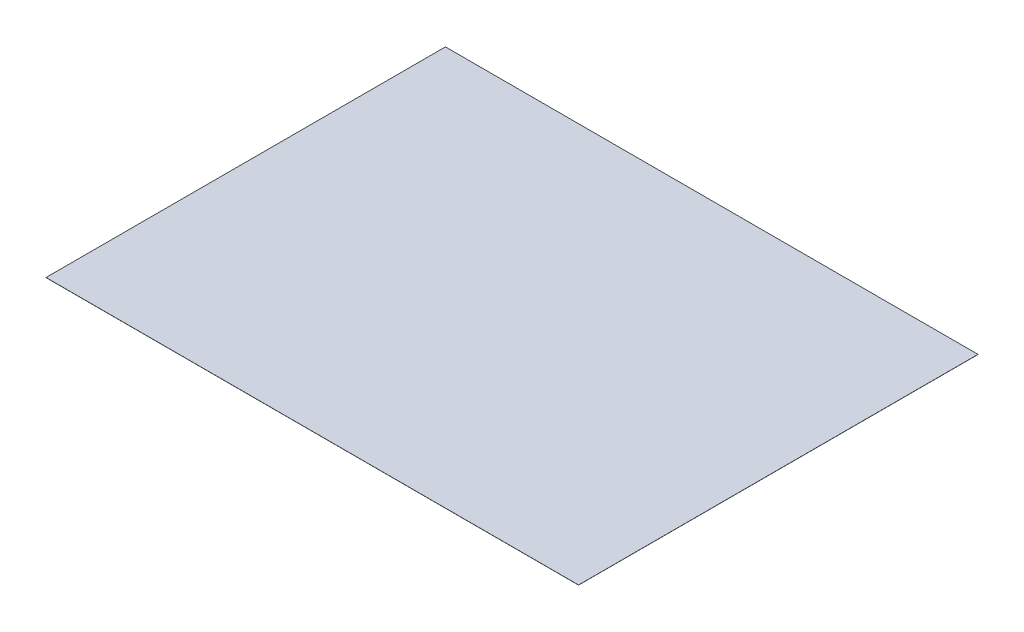
ISO-10303-21;
HEADER;
FILE_DESCRIPTION(('STEP AP214'),'2;1');
FILE_NAME('part.step','',(''),(''),'','','');
FILE_SCHEMA(('AUTOMOTIVE_DESIGN { 1 0 10303 214 1 1 1 1 }'));
ENDSEC;
DATA;
#1=APPLICATION_CONTEXT('core data for automotive mechanical design processes');
#2=APPLICATION_PROTOCOL_DEFINITION('international standard','automotive_design',2000,#1);
#3=PRODUCT_CONTEXT('',#1,'mechanical');
#4=PRODUCT('Part','Part','',(#3));
#5=PRODUCT_RELATED_PRODUCT_CATEGORY('part','',(#4));
#6=PRODUCT_DEFINITION_FORMATION('','',#4);
#7=PRODUCT_DEFINITION_CONTEXT('part definition',#1,'design');
#8=PRODUCT_DEFINITION('design','',#6,#7);
#9=PRODUCT_DEFINITION_SHAPE('','',#8);
#10=(LENGTH_UNIT() NAMED_UNIT(*) SI_UNIT(.MILLI.,.METRE.));
#11=(NAMED_UNIT(*) PLANE_ANGLE_UNIT() SI_UNIT($,.RADIAN.));
#12=(NAMED_UNIT(*) SI_UNIT($,.STERADIAN.) SOLID_ANGLE_UNIT());
#13=UNCERTAINTY_MEASURE_WITH_UNIT(LENGTH_MEASURE(1.E-05),#10,'distance_accuracy_value','');
#14=(GEOMETRIC_REPRESENTATION_CONTEXT(3) GLOBAL_UNCERTAINTY_ASSIGNED_CONTEXT((#13)) GLOBAL_UNIT_ASSIGNED_CONTEXT((#10,
#11,#12)) REPRESENTATION_CONTEXT('',''));
#15=CARTESIAN_POINT('',(0.,0.,0.));
#16=DIRECTION('',(0.,0.,1.));
#17=DIRECTION('',(1.,0.,0.));
#18=AXIS2_PLACEMENT_3D('',#15,#16,#17);
#19=CARTESIAN_POINT('',(200.,0.1,150.));
#20=DIRECTION('',(-1.,0.,0.));
#21=DIRECTION('',(0.,0.,1.));
#22=AXIS2_PLACEMENT_3D('',#19,#20,#21);
#23=PLANE('',#22);
#24=DIRECTION('',(0.,0.,-1.));
#25=VECTOR('',#24,1.);
#26=CARTESIAN_POINT('',(200.,0.,150.));
#27=LINE('',#26,#25);
#28=CARTESIAN_POINT('',(200.,0.,150.));
#29=VERTEX_POINT('',#28);
#30=CARTESIAN_POINT('',(200.,0.,-150.));
#31=VERTEX_POINT('',#30);
#32=EDGE_CURVE('E96',#29,#31,#27,.T.);
#33=ORIENTED_EDGE('',*,*,#32,.T.);
#34=DIRECTION('',(0.,-1.,0.));
#35=VECTOR('',#34,1.);
#36=CARTESIAN_POINT('',(200.,0.1,-150.));
#37=LINE('',#36,#35);
#38=CARTESIAN_POINT('',(200.,0.1,-150.));
#39=VERTEX_POINT('',#38);
#40=EDGE_CURVE('E11',#39,#31,#37,.T.);
#41=ORIENTED_EDGE('',*,*,#40,.F.);
#42=DIRECTION('',(0.,0.,-1.));
#43=VECTOR('',#42,1.);
#44=CARTESIAN_POINT('',(200.,0.1,150.));
#45=LINE('',#44,#43);
#46=CARTESIAN_POINT('',(200.,0.1,150.));
#47=VERTEX_POINT('',#46);
#48=EDGE_CURVE('E84',#47,#39,#45,.T.);
#49=ORIENTED_EDGE('',*,*,#48,.F.);
#50=DIRECTION('',(0.,-1.,0.));
#51=VECTOR('',#50,1.);
#52=CARTESIAN_POINT('',(200.,0.1,150.));
#53=LINE('',#52,#51);
#54=EDGE_CURVE('E92',#47,#29,#53,.T.);
#55=ORIENTED_EDGE('',*,*,#54,.T.);
#56=EDGE_LOOP('',(#33,#41,#49,#55));
#57=FACE_BOUND('',#56,.T.);
#58=ADVANCED_FACE('F33',(#57),#23,.F.);
#59=CARTESIAN_POINT('',(-200.,0.1,-150.));
#60=DIRECTION('',(0.,0.,1.));
#61=DIRECTION('',(1.,0.,0.));
#62=AXIS2_PLACEMENT_3D('',#59,#60,#61);
#63=PLANE('',#62);
#64=DIRECTION('',(-1.,0.,0.));
#65=VECTOR('',#64,1.);
#66=CARTESIAN_POINT('',(-200.,0.,-150.));
#67=LINE('',#66,#65);
#68=CARTESIAN_POINT('',(-200.,0.,-150.));
#69=VERTEX_POINT('',#68);
#70=EDGE_CURVE('E88',#31,#69,#67,.T.);
#71=ORIENTED_EDGE('',*,*,#70,.T.);
#72=DIRECTION('',(0.,-1.,0.));
#73=VECTOR('',#72,1.);
#74=CARTESIAN_POINT('',(-200.,0.1,-150.));
#75=LINE('',#74,#73);
#76=CARTESIAN_POINT('',(-200.,0.1,-150.));
#77=VERTEX_POINT('',#76);
#78=EDGE_CURVE('E41',#77,#69,#75,.T.);
#79=ORIENTED_EDGE('',*,*,#78,.F.);
#80=DIRECTION('',(-1.,0.,0.));
#81=VECTOR('',#80,1.);
#82=CARTESIAN_POINT('',(-200.,0.1,-150.));
#83=LINE('',#82,#81);
#84=EDGE_CURVE('E79',#39,#77,#83,.T.);
#85=ORIENTED_EDGE('',*,*,#84,.F.);
#86=ORIENTED_EDGE('',*,*,#40,.T.);
#87=EDGE_LOOP('',(#71,#79,#85,#86));
#88=FACE_BOUND('',#87,.T.);
#89=ADVANCED_FACE('F87',(#88),#63,.F.);
#90=CARTESIAN_POINT('',(-200.,0.1,150.));
#91=DIRECTION('',(1.,0.,0.));
#92=DIRECTION('',(0.,0.,-1.));
#93=AXIS2_PLACEMENT_3D('',#90,#91,#92);
#94=PLANE('',#93);
#95=DIRECTION('',(0.,0.,1.));
#96=VECTOR('',#95,1.);
#97=CARTESIAN_POINT('',(-200.,0.,150.));
#98=LINE('',#97,#96);
#99=CARTESIAN_POINT('',(-200.,0.,150.));
#100=VERTEX_POINT('',#99);
#101=EDGE_CURVE('E66',#69,#100,#98,.T.);
#102=ORIENTED_EDGE('',*,*,#101,.T.);
#103=DIRECTION('',(0.,-1.,0.));
#104=VECTOR('',#103,1.);
#105=CARTESIAN_POINT('',(-200.,0.1,150.));
#106=LINE('',#105,#104);
#107=CARTESIAN_POINT('',(-200.,0.1,150.));
#108=VERTEX_POINT('',#107);
#109=EDGE_CURVE('E89',#108,#100,#106,.T.);
#110=ORIENTED_EDGE('',*,*,#109,.F.);
#111=DIRECTION('',(0.,0.,1.));
#112=VECTOR('',#111,1.);
#113=CARTESIAN_POINT('',(-200.,0.1,150.));
#114=LINE('',#113,#112);
#115=EDGE_CURVE('E82',#77,#108,#114,.T.);
#116=ORIENTED_EDGE('',*,*,#115,.F.);
#117=ORIENTED_EDGE('',*,*,#78,.T.);
#118=EDGE_LOOP('',(#102,#110,#116,#117));
#119=FACE_BOUND('',#118,.T.);
#120=ADVANCED_FACE('F90',(#119),#94,.F.);
#121=CARTESIAN_POINT('',(-200.,0.1,150.));
#122=DIRECTION('',(0.,0.,-1.));
#123=DIRECTION('',(-1.,0.,0.));
#124=AXIS2_PLACEMENT_3D('',#121,#122,#123);
#125=PLANE('',#124);
#126=DIRECTION('',(1.,0.,0.));
#127=VECTOR('',#126,1.);
#128=CARTESIAN_POINT('',(-200.,0.,150.));
#129=LINE('',#128,#127);
#130=EDGE_CURVE('E72',#100,#29,#129,.T.);
#131=ORIENTED_EDGE('',*,*,#130,.T.);
#132=ORIENTED_EDGE('',*,*,#54,.F.);
#133=DIRECTION('',(1.,0.,0.));
#134=VECTOR('',#133,1.);
#135=CARTESIAN_POINT('',(-200.,0.1,150.));
#136=LINE('',#135,#134);
#137=EDGE_CURVE('E49',#108,#47,#136,.T.);
#138=ORIENTED_EDGE('',*,*,#137,.F.);
#139=ORIENTED_EDGE('',*,*,#109,.T.);
#140=EDGE_LOOP('',(#131,#132,#138,#139));
#141=FACE_BOUND('',#140,.T.);
#142=ADVANCED_FACE('F103',(#141),#125,.F.);
#143=CARTESIAN_POINT('',(0.,0.1,0.));
#144=DIRECTION('',(0.,-1.,0.));
#145=DIRECTION('',(0.,0.,-1.));
#146=AXIS2_PLACEMENT_3D('',#143,#144,#145);
#147=PLANE('',#146);
#148=ORIENTED_EDGE('',*,*,#48,.T.);
#149=ORIENTED_EDGE('',*,*,#84,.T.);
#150=ORIENTED_EDGE('',*,*,#115,.T.);
#151=ORIENTED_EDGE('',*,*,#137,.T.);
#152=EDGE_LOOP('',(#148,#149,#150,#151));
#153=FACE_BOUND('',#152,.T.);
#154=ADVANCED_FACE('F80',(#153),#147,.F.);
#155=CARTESIAN_POINT('',(0.,0.,0.));
#156=DIRECTION('',(0.,-1.,0.));
#157=DIRECTION('',(0.,0.,-1.));
#158=AXIS2_PLACEMENT_3D('',#155,#156,#157);
#159=PLANE('',#158);
#160=ORIENTED_EDGE('',*,*,#32,.F.);
#161=ORIENTED_EDGE('',*,*,#130,.F.);
#162=ORIENTED_EDGE('',*,*,#101,.F.);
#163=ORIENTED_EDGE('',*,*,#70,.F.);
#164=EDGE_LOOP('',(#160,#161,#162,#163));
#165=FACE_BOUND('',#164,.T.);
#166=ADVANCED_FACE('F106',(#165),#159,.T.);
#167=CLOSED_SHELL('',(#58,#89,#120,#142,#154,#166));
#168=MANIFOLD_SOLID_BREP('B2',#167);
#169=ADVANCED_BREP_SHAPE_REPRESENTATION('',(#18,#168),#14);
#170=SHAPE_DEFINITION_REPRESENTATION(#9,#169);
ENDSEC;
END-ISO-10303-21;
